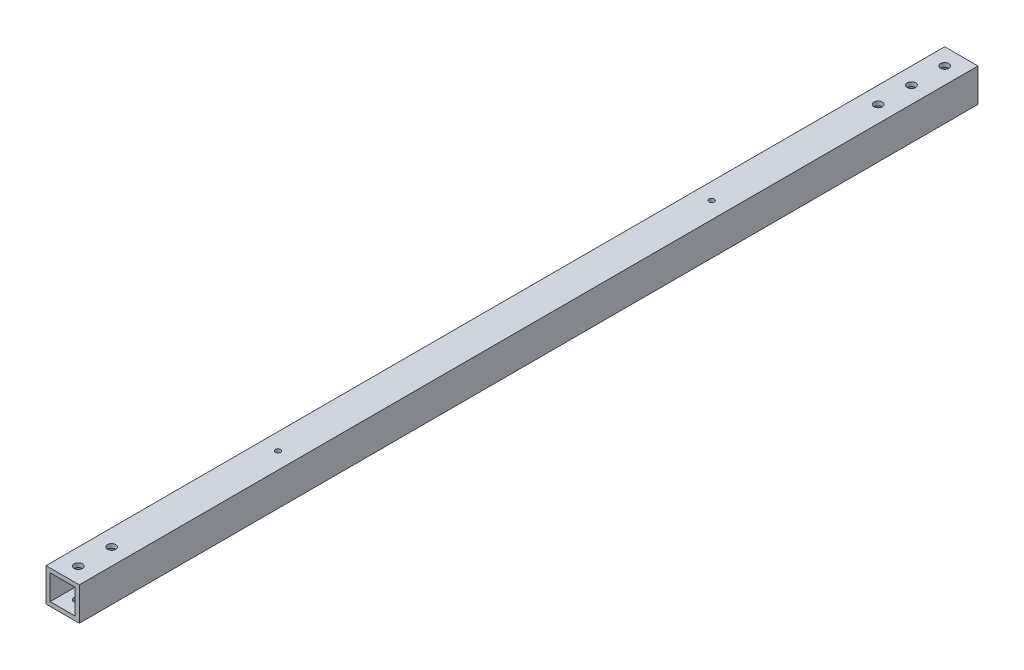
ISO-10303-21;
HEADER;
FILE_DESCRIPTION(('STEP AP214'),'2;1');
FILE_NAME('part.step','',(''),(''),'','','');
FILE_SCHEMA(('AUTOMOTIVE_DESIGN { 1 0 10303 214 1 1 1 1 }'));
ENDSEC;
DATA;
#1=APPLICATION_CONTEXT('core data for automotive mechanical design processes');
#2=APPLICATION_PROTOCOL_DEFINITION('international standard','automotive_design',2000,#1);
#3=PRODUCT_CONTEXT('',#1,'mechanical');
#4=PRODUCT('Part','Part','',(#3));
#5=PRODUCT_RELATED_PRODUCT_CATEGORY('part','',(#4));
#6=PRODUCT_DEFINITION_FORMATION('','',#4);
#7=PRODUCT_DEFINITION_CONTEXT('part definition',#1,'design');
#8=PRODUCT_DEFINITION('design','',#6,#7);
#9=PRODUCT_DEFINITION_SHAPE('','',#8);
#10=(LENGTH_UNIT() NAMED_UNIT(*) SI_UNIT(.MILLI.,.METRE.));
#11=(NAMED_UNIT(*) PLANE_ANGLE_UNIT() SI_UNIT($,.RADIAN.));
#12=(NAMED_UNIT(*) SI_UNIT($,.STERADIAN.) SOLID_ANGLE_UNIT());
#13=UNCERTAINTY_MEASURE_WITH_UNIT(LENGTH_MEASURE(1.E-05),#10,'distance_accuracy_value','');
#14=(GEOMETRIC_REPRESENTATION_CONTEXT(3) GLOBAL_UNCERTAINTY_ASSIGNED_CONTEXT((#13)) GLOBAL_UNIT_ASSIGNED_CONTEXT((#10,
#11,#12)) REPRESENTATION_CONTEXT('',''));
#15=CARTESIAN_POINT('',(0.,0.,0.));
#16=DIRECTION('',(0.,0.,1.));
#17=DIRECTION('',(1.,0.,0.));
#18=AXIS2_PLACEMENT_3D('',#15,#16,#17);
#19=CARTESIAN_POINT('',(0.,0.,342.9));
#20=DIRECTION('',(0.,0.,1.));
#21=DIRECTION('',(1.,0.,0.));
#22=AXIS2_PLACEMENT_3D('',#19,#20,#21);
#23=PLANE('',#22);
#24=DIRECTION('',(0.,-1.,0.));
#25=VECTOR('',#24,1.);
#26=CARTESIAN_POINT('',(-12.7,12.7,342.9));
#27=LINE('',#26,#25);
#28=CARTESIAN_POINT('',(-12.7,12.7,342.9));
#29=VERTEX_POINT('',#28);
#30=CARTESIAN_POINT('',(-12.7,-12.7,342.9));
#31=VERTEX_POINT('',#30);
#32=EDGE_CURVE('E115',#29,#31,#27,.T.);
#33=ORIENTED_EDGE('',*,*,#32,.T.);
#34=DIRECTION('',(1.,0.,0.));
#35=VECTOR('',#34,1.);
#36=CARTESIAN_POINT('',(-12.7,-12.7,342.9));
#37=LINE('',#36,#35);
#38=CARTESIAN_POINT('',(12.7,-12.7,342.9));
#39=VERTEX_POINT('',#38);
#40=EDGE_CURVE('E163',#31,#39,#37,.T.);
#41=ORIENTED_EDGE('',*,*,#40,.T.);
#42=DIRECTION('',(0.,1.,0.));
#43=VECTOR('',#42,1.);
#44=CARTESIAN_POINT('',(12.7,-12.7,342.9));
#45=LINE('',#44,#43);
#46=CARTESIAN_POINT('',(12.7,12.7,342.9));
#47=VERTEX_POINT('',#46);
#48=EDGE_CURVE('E165',#39,#47,#45,.T.);
#49=ORIENTED_EDGE('',*,*,#48,.T.);
#50=DIRECTION('',(-1.,0.,0.));
#51=VECTOR('',#50,1.);
#52=CARTESIAN_POINT('',(12.7,12.7,342.9));
#53=LINE('',#52,#51);
#54=EDGE_CURVE('E62',#47,#29,#53,.T.);
#55=ORIENTED_EDGE('',*,*,#54,.T.);
#56=EDGE_LOOP('',(#33,#41,#49,#55));
#57=FACE_BOUND('',#56,.T.);
#58=DIRECTION('',(1.,0.,0.));
#59=VECTOR('',#58,1.);
#60=CARTESIAN_POINT('',(-9.525,-9.525,342.9));
#61=LINE('',#60,#59);
#62=CARTESIAN_POINT('',(-9.525,-9.525,342.9));
#63=VERTEX_POINT('',#62);
#64=CARTESIAN_POINT('',(9.52500000000001,-9.525,342.9));
#65=VERTEX_POINT('',#64);
#66=EDGE_CURVE('E152',#63,#65,#61,.T.);
#67=ORIENTED_EDGE('',*,*,#66,.F.);
#68=DIRECTION('',(0.,-1.,0.));
#69=VECTOR('',#68,1.);
#70=CARTESIAN_POINT('',(-9.52500000000001,9.525,342.9));
#71=LINE('',#70,#69);
#72=CARTESIAN_POINT('',(-9.52500000000001,9.525,342.9));
#73=VERTEX_POINT('',#72);
#74=EDGE_CURVE('E112',#73,#63,#71,.T.);
#75=ORIENTED_EDGE('',*,*,#74,.F.);
#76=DIRECTION('',(-1.,0.,0.));
#77=VECTOR('',#76,1.);
#78=CARTESIAN_POINT('',(9.525,9.525,342.9));
#79=LINE('',#78,#77);
#80=CARTESIAN_POINT('',(9.525,9.525,342.9));
#81=VERTEX_POINT('',#80);
#82=EDGE_CURVE('E156',#81,#73,#79,.T.);
#83=ORIENTED_EDGE('',*,*,#82,.F.);
#84=DIRECTION('',(0.,1.,0.));
#85=VECTOR('',#84,1.);
#86=CARTESIAN_POINT('',(9.52500000000001,-9.525,342.9));
#87=LINE('',#86,#85);
#88=EDGE_CURVE('E154',#65,#81,#87,.T.);
#89=ORIENTED_EDGE('',*,*,#88,.F.);
#90=EDGE_LOOP('',(#67,#75,#83,#89));
#91=FACE_BOUND('',#90,.T.);
#92=ADVANCED_FACE('F37',(#57,#91),#23,.T.);
#93=CARTESIAN_POINT('',(-12.7,12.7,342.9));
#94=DIRECTION('',(1.,0.,0.));
#95=DIRECTION('',(0.,0.,-1.));
#96=AXIS2_PLACEMENT_3D('',#93,#94,#95);
#97=PLANE('',#96);
#98=DIRECTION('',(0.,0.,-1.));
#99=VECTOR('',#98,1.);
#100=CARTESIAN_POINT('',(-12.7,12.7,342.9));
#101=LINE('',#100,#99);
#102=CARTESIAN_POINT('',(-12.7,12.7,-342.9));
#103=VERTEX_POINT('',#102);
#104=EDGE_CURVE('E168',#29,#103,#101,.T.);
#105=ORIENTED_EDGE('',*,*,#104,.T.);
#106=DIRECTION('',(0.,-1.,0.));
#107=VECTOR('',#106,1.);
#108=CARTESIAN_POINT('',(-12.7,12.7,-342.9));
#109=LINE('',#108,#107);
#110=CARTESIAN_POINT('',(-12.7,-12.7,-342.9));
#111=VERTEX_POINT('',#110);
#112=EDGE_CURVE('E139',#103,#111,#109,.T.);
#113=ORIENTED_EDGE('',*,*,#112,.T.);
#114=DIRECTION('',(0.,0.,-1.));
#115=VECTOR('',#114,1.);
#116=CARTESIAN_POINT('',(-12.7,-12.7,342.9));
#117=LINE('',#116,#115);
#118=EDGE_CURVE('E11',#31,#111,#117,.T.);
#119=ORIENTED_EDGE('',*,*,#118,.F.);
#120=ORIENTED_EDGE('',*,*,#32,.F.);
#121=EDGE_LOOP('',(#105,#113,#119,#120));
#122=FACE_BOUND('',#121,.T.);
#123=ADVANCED_FACE('F39',(#122),#97,.F.);
#124=CARTESIAN_POINT('',(-12.7,-12.7,342.9));
#125=DIRECTION('',(0.,1.,0.));
#126=DIRECTION('',(-1.,0.,0.));
#127=AXIS2_PLACEMENT_3D('',#124,#125,#126);
#128=PLANE('',#127);
#129=CARTESIAN_POINT('',(7.23379689482329E-13,-12.7,330.911799987541));
#130=DIRECTION('',(0.,1.,0.));
#131=DIRECTION('',(0.,0.,1.));
#132=AXIS2_PLACEMENT_3D('',#129,#130,#131);
#133=CIRCLE('',#132,3.96239999999999);
#134=CARTESIAN_POINT('',(7.23379689482329E-13,-12.7,334.874199987541));
#135=VERTEX_POINT('',#134);
#136=EDGE_CURVE('E285',#135,#135,#133,.T.);
#137=ORIENTED_EDGE('',*,*,#136,.T.);
#138=EDGE_LOOP('',(#137));
#139=FACE_BOUND('',#138,.T.);
#140=CARTESIAN_POINT('',(0.,-12.7,305.511799987541));
#141=DIRECTION('',(0.,1.,0.));
#142=DIRECTION('',(0.,0.,1.));
#143=AXIS2_PLACEMENT_3D('',#140,#141,#142);
#144=CIRCLE('',#143,3.96239999999999);
#145=CARTESIAN_POINT('',(0.,-12.7,309.474199987541));
#146=VERTEX_POINT('',#145);
#147=EDGE_CURVE('E289',#146,#146,#144,.T.);
#148=ORIENTED_EDGE('',*,*,#147,.T.);
#149=EDGE_LOOP('',(#148));
#150=FACE_BOUND('',#149,.T.);
#151=CARTESIAN_POINT('',(-3.7175124090183E-12,-12.7,-330.199999999998));
#152=DIRECTION('',(0.,1.,0.));
#153=DIRECTION('',(0.,0.,1.));
#154=AXIS2_PLACEMENT_3D('',#151,#152,#153);
#155=CIRCLE('',#154,3.96239999999999);
#156=CARTESIAN_POINT('',(-3.7175124090183E-12,-12.7,-326.237599999998));
#157=VERTEX_POINT('',#156);
#158=EDGE_CURVE('E197',#157,#157,#155,.T.);
#159=ORIENTED_EDGE('',*,*,#158,.T.);
#160=EDGE_LOOP('',(#159));
#161=FACE_BOUND('',#160,.T.);
#162=CARTESIAN_POINT('',(0.,-12.7,-304.799999999998));
#163=DIRECTION('',(0.,1.,0.));
#164=DIRECTION('',(0.,0.,1.));
#165=AXIS2_PLACEMENT_3D('',#162,#163,#164);
#166=CIRCLE('',#165,3.96239999999999);
#167=CARTESIAN_POINT('',(0.,-12.7,-300.837599999998));
#168=VERTEX_POINT('',#167);
#169=EDGE_CURVE('E189',#168,#168,#166,.T.);
#170=ORIENTED_EDGE('',*,*,#169,.T.);
#171=EDGE_LOOP('',(#170));
#172=FACE_BOUND('',#171,.T.);
#173=CARTESIAN_POINT('',(-2.38524477946811E-12,-12.7,-279.399999999999));
#174=DIRECTION('',(0.,1.,0.));
#175=DIRECTION('',(0.,0.,1.));
#176=AXIS2_PLACEMENT_3D('',#173,#174,#175);
#177=CIRCLE('',#176,3.96239999999999);
#178=CARTESIAN_POINT('',(-2.38524477946811E-12,-12.7,-275.437599999999));
#179=VERTEX_POINT('',#178);
#180=EDGE_CURVE('E210',#179,#179,#177,.T.);
#181=ORIENTED_EDGE('',*,*,#180,.T.);
#182=EDGE_LOOP('',(#181));
#183=FACE_BOUND('',#182,.T.);
#184=CARTESIAN_POINT('',(0.,-12.7,-152.4));
#185=DIRECTION('',(0.,1.,0.));
#186=DIRECTION('',(0.,0.,1.));
#187=AXIS2_PLACEMENT_3D('',#184,#185,#186);
#188=CIRCLE('',#187,1.98437499999998);
#189=CARTESIAN_POINT('',(0.,-12.7,-150.415625));
#190=VERTEX_POINT('',#189);
#191=EDGE_CURVE('E223',#190,#190,#188,.T.);
#192=ORIENTED_EDGE('',*,*,#191,.T.);
#193=EDGE_LOOP('',(#192));
#194=FACE_BOUND('',#193,.T.);
#195=CARTESIAN_POINT('',(0.,-12.7,178.5118096));
#196=DIRECTION('',(0.,1.,0.));
#197=DIRECTION('',(0.,0.,1.));
#198=AXIS2_PLACEMENT_3D('',#195,#196,#197);
#199=CIRCLE('',#198,1.98437499999998);
#200=CARTESIAN_POINT('',(0.,-12.7,180.4961846));
#201=VERTEX_POINT('',#200);
#202=EDGE_CURVE('E235',#201,#201,#199,.T.);
#203=ORIENTED_EDGE('',*,*,#202,.T.);
#204=EDGE_LOOP('',(#203));
#205=FACE_BOUND('',#204,.T.);
#206=ORIENTED_EDGE('',*,*,#118,.T.);
#207=DIRECTION('',(1.,0.,0.));
#208=VECTOR('',#207,1.);
#209=CARTESIAN_POINT('',(-12.7,-12.7,-342.9));
#210=LINE('',#209,#208);
#211=CARTESIAN_POINT('',(12.7,-12.7,-342.9));
#212=VERTEX_POINT('',#211);
#213=EDGE_CURVE('E142',#111,#212,#210,.T.);
#214=ORIENTED_EDGE('',*,*,#213,.T.);
#215=DIRECTION('',(0.,0.,-1.));
#216=VECTOR('',#215,1.);
#217=CARTESIAN_POINT('',(12.7,-12.7,342.9));
#218=LINE('',#217,#216);
#219=EDGE_CURVE('E46',#39,#212,#218,.T.);
#220=ORIENTED_EDGE('',*,*,#219,.F.);
#221=ORIENTED_EDGE('',*,*,#40,.F.);
#222=EDGE_LOOP('',(#206,#214,#220,#221));
#223=FACE_BOUND('',#222,.T.);
#224=ADVANCED_FACE('F266',(#139,#150,#161,#172,#183,#194,#205,#223),#128,.F.);
#225=CARTESIAN_POINT('',(12.7,-12.7,342.9));
#226=DIRECTION('',(-1.,0.,0.));
#227=DIRECTION('',(0.,0.,1.));
#228=AXIS2_PLACEMENT_3D('',#225,#226,#227);
#229=PLANE('',#228);
#230=ORIENTED_EDGE('',*,*,#219,.T.);
#231=DIRECTION('',(0.,1.,0.));
#232=VECTOR('',#231,1.);
#233=CARTESIAN_POINT('',(12.7,-12.7,-342.9));
#234=LINE('',#233,#232);
#235=CARTESIAN_POINT('',(12.7,12.7,-342.9));
#236=VERTEX_POINT('',#235);
#237=EDGE_CURVE('E145',#212,#236,#234,.T.);
#238=ORIENTED_EDGE('',*,*,#237,.T.);
#239=DIRECTION('',(0.,0.,-1.));
#240=VECTOR('',#239,1.);
#241=CARTESIAN_POINT('',(12.7,12.7,342.9));
#242=LINE('',#241,#240);
#243=EDGE_CURVE('E170',#47,#236,#242,.T.);
#244=ORIENTED_EDGE('',*,*,#243,.F.);
#245=ORIENTED_EDGE('',*,*,#48,.F.);
#246=EDGE_LOOP('',(#230,#238,#244,#245));
#247=FACE_BOUND('',#246,.T.);
#248=ADVANCED_FACE('F273',(#247),#229,.F.);
#249=CARTESIAN_POINT('',(12.7,12.7,342.9));
#250=DIRECTION('',(0.,-1.,0.));
#251=DIRECTION('',(1.,0.,0.));
#252=AXIS2_PLACEMENT_3D('',#249,#250,#251);
#253=PLANE('',#252);
#254=CARTESIAN_POINT('',(7.23379689482329E-13,12.7,330.911799987541));
#255=DIRECTION('',(0.,1.,0.));
#256=DIRECTION('',(0.,0.,1.));
#257=AXIS2_PLACEMENT_3D('',#254,#255,#256);
#258=CIRCLE('',#257,3.17499999999999);
#259=CARTESIAN_POINT('',(7.23379689482329E-13,12.7,334.086799987541));
#260=VERTEX_POINT('',#259);
#261=EDGE_CURVE('E376',#260,#260,#258,.T.);
#262=ORIENTED_EDGE('',*,*,#261,.F.);
#263=EDGE_LOOP('',(#262));
#264=FACE_BOUND('',#263,.T.);
#265=CARTESIAN_POINT('',(0.,12.7,305.511799987541));
#266=DIRECTION('',(0.,1.,0.));
#267=DIRECTION('',(0.,0.,1.));
#268=AXIS2_PLACEMENT_3D('',#265,#266,#267);
#269=CIRCLE('',#268,3.17499999999999);
#270=CARTESIAN_POINT('',(0.,12.7,308.686799987541));
#271=VERTEX_POINT('',#270);
#272=EDGE_CURVE('E387',#271,#271,#269,.T.);
#273=ORIENTED_EDGE('',*,*,#272,.F.);
#274=EDGE_LOOP('',(#273));
#275=FACE_BOUND('',#274,.T.);
#276=CARTESIAN_POINT('',(-3.7175124090183E-12,12.7,-330.199999999998));
#277=DIRECTION('',(0.,1.,0.));
#278=DIRECTION('',(0.,0.,1.));
#279=AXIS2_PLACEMENT_3D('',#276,#277,#278);
#280=CIRCLE('',#279,3.17499999999999);
#281=CARTESIAN_POINT('',(-3.7175124090183E-12,12.7,-327.024999999998));
#282=VERTEX_POINT('',#281);
#283=EDGE_CURVE('E192',#282,#282,#280,.T.);
#284=ORIENTED_EDGE('',*,*,#283,.F.);
#285=EDGE_LOOP('',(#284));
#286=FACE_BOUND('',#285,.T.);
#287=CARTESIAN_POINT('',(0.,12.7,-304.799999999998));
#288=DIRECTION('',(0.,1.,0.));
#289=DIRECTION('',(0.,0.,1.));
#290=AXIS2_PLACEMENT_3D('',#287,#288,#289);
#291=CIRCLE('',#290,3.17499999999999);
#292=CARTESIAN_POINT('',(0.,12.7,-301.624999999998));
#293=VERTEX_POINT('',#292);
#294=EDGE_CURVE('E203',#293,#293,#291,.T.);
#295=ORIENTED_EDGE('',*,*,#294,.F.);
#296=EDGE_LOOP('',(#295));
#297=FACE_BOUND('',#296,.T.);
#298=CARTESIAN_POINT('',(-2.38524477946811E-12,12.7,-279.399999999999));
#299=DIRECTION('',(0.,1.,0.));
#300=DIRECTION('',(0.,0.,1.));
#301=AXIS2_PLACEMENT_3D('',#298,#299,#300);
#302=CIRCLE('',#301,3.17499999999999);
#303=CARTESIAN_POINT('',(-2.38524477946811E-12,12.7,-276.224999999999));
#304=VERTEX_POINT('',#303);
#305=EDGE_CURVE('E213',#304,#304,#302,.T.);
#306=ORIENTED_EDGE('',*,*,#305,.F.);
#307=EDGE_LOOP('',(#306));
#308=FACE_BOUND('',#307,.T.);
#309=CARTESIAN_POINT('',(0.,12.7,-152.4));
#310=DIRECTION('',(0.,1.,0.));
#311=DIRECTION('',(0.,0.,1.));
#312=AXIS2_PLACEMENT_3D('',#309,#310,#311);
#313=CIRCLE('',#312,1.98437499999999);
#314=CARTESIAN_POINT('',(0.,12.7,-150.415625));
#315=VERTEX_POINT('',#314);
#316=EDGE_CURVE('E220',#315,#315,#313,.T.);
#317=ORIENTED_EDGE('',*,*,#316,.F.);
#318=EDGE_LOOP('',(#317));
#319=FACE_BOUND('',#318,.T.);
#320=CARTESIAN_POINT('',(0.,12.7,178.5118096));
#321=DIRECTION('',(0.,1.,0.));
#322=DIRECTION('',(0.,0.,1.));
#323=AXIS2_PLACEMENT_3D('',#320,#321,#322);
#324=CIRCLE('',#323,1.98437499999999);
#325=CARTESIAN_POINT('',(0.,12.7,180.4961846));
#326=VERTEX_POINT('',#325);
#327=EDGE_CURVE('E232',#326,#326,#324,.T.);
#328=ORIENTED_EDGE('',*,*,#327,.F.);
#329=EDGE_LOOP('',(#328));
#330=FACE_BOUND('',#329,.T.);
#331=ORIENTED_EDGE('',*,*,#243,.T.);
#332=DIRECTION('',(-1.,0.,0.));
#333=VECTOR('',#332,1.);
#334=CARTESIAN_POINT('',(12.7,12.7,-342.9));
#335=LINE('',#334,#333);
#336=EDGE_CURVE('E148',#236,#103,#335,.T.);
#337=ORIENTED_EDGE('',*,*,#336,.T.);
#338=ORIENTED_EDGE('',*,*,#104,.F.);
#339=ORIENTED_EDGE('',*,*,#54,.F.);
#340=EDGE_LOOP('',(#331,#337,#338,#339));
#341=FACE_BOUND('',#340,.T.);
#342=ADVANCED_FACE('F270',(#264,#275,#286,#297,#308,#319,#330,#341),#253,.F.);
#343=CARTESIAN_POINT('',(-9.52500000000001,9.525,342.9));
#344=DIRECTION('',(1.,0.,0.));
#345=DIRECTION('',(0.,1.,0.));
#346=AXIS2_PLACEMENT_3D('',#343,#344,#345);
#347=PLANE('',#346);
#348=DIRECTION('',(0.,0.,-1.));
#349=VECTOR('',#348,1.);
#350=CARTESIAN_POINT('',(-9.525,-9.525,342.9));
#351=LINE('',#350,#349);
#352=CARTESIAN_POINT('',(-9.525,-9.525,-342.9));
#353=VERTEX_POINT('',#352);
#354=EDGE_CURVE('E104',#63,#353,#351,.T.);
#355=ORIENTED_EDGE('',*,*,#354,.T.);
#356=DIRECTION('',(0.,-1.,0.));
#357=VECTOR('',#356,1.);
#358=CARTESIAN_POINT('',(-9.52500000000001,9.525,-342.9));
#359=LINE('',#358,#357);
#360=CARTESIAN_POINT('',(-9.52500000000001,9.525,-342.9));
#361=VERTEX_POINT('',#360);
#362=EDGE_CURVE('E109',#361,#353,#359,.T.);
#363=ORIENTED_EDGE('',*,*,#362,.F.);
#364=DIRECTION('',(0.,0.,-1.));
#365=VECTOR('',#364,1.);
#366=CARTESIAN_POINT('',(-9.52500000000001,9.525,342.9));
#367=LINE('',#366,#365);
#368=EDGE_CURVE('E158',#73,#361,#367,.T.);
#369=ORIENTED_EDGE('',*,*,#368,.F.);
#370=ORIENTED_EDGE('',*,*,#74,.T.);
#371=EDGE_LOOP('',(#355,#363,#369,#370));
#372=FACE_BOUND('',#371,.T.);
#373=ADVANCED_FACE('F106',(#372),#347,.T.);
#374=CARTESIAN_POINT('',(-9.525,-9.525,342.9));
#375=DIRECTION('',(0.,1.,0.));
#376=DIRECTION('',(0.,0.,1.));
#377=AXIS2_PLACEMENT_3D('',#374,#375,#376);
#378=PLANE('',#377);
#379=CARTESIAN_POINT('',(7.23379689482329E-13,-9.525,330.911799987541));
#380=DIRECTION('',(0.,1.,0.));
#381=DIRECTION('',(0.,0.,1.));
#382=AXIS2_PLACEMENT_3D('',#379,#380,#381);
#383=CIRCLE('',#382,3.17499999999999);
#384=CARTESIAN_POINT('',(7.23379689482329E-13,-9.525,334.086799987541));
#385=VERTEX_POINT('',#384);
#386=EDGE_CURVE('E383',#385,#385,#383,.T.);
#387=ORIENTED_EDGE('',*,*,#386,.F.);
#388=EDGE_LOOP('',(#387));
#389=FACE_BOUND('',#388,.T.);
#390=CARTESIAN_POINT('',(0.,-9.525,305.511799987541));
#391=DIRECTION('',(0.,1.,0.));
#392=DIRECTION('',(0.,0.,1.));
#393=AXIS2_PLACEMENT_3D('',#390,#391,#392);
#394=CIRCLE('',#393,3.17499999999999);
#395=CARTESIAN_POINT('',(0.,-9.525,308.686799987541));
#396=VERTEX_POINT('',#395);
#397=EDGE_CURVE('E393',#396,#396,#394,.T.);
#398=ORIENTED_EDGE('',*,*,#397,.F.);
#399=EDGE_LOOP('',(#398));
#400=FACE_BOUND('',#399,.T.);
#401=CARTESIAN_POINT('',(-3.7175124090183E-12,-9.525,-330.199999999998));
#402=DIRECTION('',(0.,1.,0.));
#403=DIRECTION('',(0.,0.,1.));
#404=AXIS2_PLACEMENT_3D('',#401,#402,#403);
#405=CIRCLE('',#404,3.17499999999999);
#406=CARTESIAN_POINT('',(-3.7175124090183E-12,-9.525,-327.024999999998));
#407=VERTEX_POINT('',#406);
#408=EDGE_CURVE('E182',#407,#407,#405,.T.);
#409=ORIENTED_EDGE('',*,*,#408,.F.);
#410=EDGE_LOOP('',(#409));
#411=FACE_BOUND('',#410,.T.);
#412=CARTESIAN_POINT('',(0.,-9.525,-304.799999999998));
#413=DIRECTION('',(0.,1.,0.));
#414=DIRECTION('',(0.,0.,1.));
#415=AXIS2_PLACEMENT_3D('',#412,#413,#414);
#416=CIRCLE('',#415,3.17499999999999);
#417=CARTESIAN_POINT('',(0.,-9.525,-301.624999999998));
#418=VERTEX_POINT('',#417);
#419=EDGE_CURVE('E180',#418,#418,#416,.T.);
#420=ORIENTED_EDGE('',*,*,#419,.F.);
#421=EDGE_LOOP('',(#420));
#422=FACE_BOUND('',#421,.T.);
#423=CARTESIAN_POINT('',(-2.38524477946811E-12,-9.525,-279.399999999999));
#424=DIRECTION('',(0.,1.,0.));
#425=DIRECTION('',(0.,0.,1.));
#426=AXIS2_PLACEMENT_3D('',#423,#424,#425);
#427=CIRCLE('',#426,3.17499999999999);
#428=CARTESIAN_POINT('',(-2.38524477946811E-12,-9.525,-276.224999999999));
#429=VERTEX_POINT('',#428);
#430=EDGE_CURVE('E176',#429,#429,#427,.T.);
#431=ORIENTED_EDGE('',*,*,#430,.F.);
#432=EDGE_LOOP('',(#431));
#433=FACE_BOUND('',#432,.T.);
#434=CARTESIAN_POINT('',(0.,-9.525,-152.4));
#435=DIRECTION('',(0.,1.,0.));
#436=DIRECTION('',(0.,0.,1.));
#437=AXIS2_PLACEMENT_3D('',#434,#435,#436);
#438=CIRCLE('',#437,1.98437499999999);
#439=CARTESIAN_POINT('',(0.,-9.525,-150.415625));
#440=VERTEX_POINT('',#439);
#441=EDGE_CURVE('E229',#440,#440,#438,.T.);
#442=ORIENTED_EDGE('',*,*,#441,.F.);
#443=EDGE_LOOP('',(#442));
#444=FACE_BOUND('',#443,.T.);
#445=CARTESIAN_POINT('',(0.,-9.525,178.5118096));
#446=DIRECTION('',(0.,1.,0.));
#447=DIRECTION('',(0.,0.,1.));
#448=AXIS2_PLACEMENT_3D('',#445,#446,#447);
#449=CIRCLE('',#448,1.98437499999999);
#450=CARTESIAN_POINT('',(0.,-9.525,180.4961846));
#451=VERTEX_POINT('',#450);
#452=EDGE_CURVE('E130',#451,#451,#449,.T.);
#453=ORIENTED_EDGE('',*,*,#452,.F.);
#454=EDGE_LOOP('',(#453));
#455=FACE_BOUND('',#454,.T.);
#456=DIRECTION('',(0.,0.,-1.));
#457=VECTOR('',#456,1.);
#458=CARTESIAN_POINT('',(9.52500000000001,-9.525,342.9));
#459=LINE('',#458,#457);
#460=CARTESIAN_POINT('',(9.52500000000001,-9.525,-342.9));
#461=VERTEX_POINT('',#460);
#462=EDGE_CURVE('E116',#65,#461,#459,.T.);
#463=ORIENTED_EDGE('',*,*,#462,.T.);
#464=DIRECTION('',(1.,0.,0.));
#465=VECTOR('',#464,1.);
#466=CARTESIAN_POINT('',(-9.525,-9.525,-342.9));
#467=LINE('',#466,#465);
#468=EDGE_CURVE('E119',#353,#461,#467,.T.);
#469=ORIENTED_EDGE('',*,*,#468,.F.);
#470=ORIENTED_EDGE('',*,*,#354,.F.);
#471=ORIENTED_EDGE('',*,*,#66,.T.);
#472=EDGE_LOOP('',(#463,#469,#470,#471));
#473=FACE_BOUND('',#472,.T.);
#474=ADVANCED_FACE('F120',(#389,#400,#411,#422,#433,#444,#455,#473),#378,.T.);
#475=CARTESIAN_POINT('',(9.52500000000001,-9.525,342.9));
#476=DIRECTION('',(-1.,0.,0.));
#477=DIRECTION('',(0.,-1.,0.));
#478=AXIS2_PLACEMENT_3D('',#475,#476,#477);
#479=PLANE('',#478);
#480=DIRECTION('',(0.,0.,-1.));
#481=VECTOR('',#480,1.);
#482=CARTESIAN_POINT('',(9.525,9.525,342.9));
#483=LINE('',#482,#481);
#484=CARTESIAN_POINT('',(9.525,9.525,-342.9));
#485=VERTEX_POINT('',#484);
#486=EDGE_CURVE('E54',#81,#485,#483,.T.);
#487=ORIENTED_EDGE('',*,*,#486,.T.);
#488=DIRECTION('',(0.,1.,0.));
#489=VECTOR('',#488,1.);
#490=CARTESIAN_POINT('',(9.52500000000001,-9.525,-342.9));
#491=LINE('',#490,#489);
#492=EDGE_CURVE('E125',#461,#485,#491,.T.);
#493=ORIENTED_EDGE('',*,*,#492,.F.);
#494=ORIENTED_EDGE('',*,*,#462,.F.);
#495=ORIENTED_EDGE('',*,*,#88,.T.);
#496=EDGE_LOOP('',(#487,#493,#494,#495));
#497=FACE_BOUND('',#496,.T.);
#498=ADVANCED_FACE('F245',(#497),#479,.T.);
#499=CARTESIAN_POINT('',(9.525,9.525,342.9));
#500=DIRECTION('',(0.,-1.,0.));
#501=DIRECTION('',(0.,0.,-1.));
#502=AXIS2_PLACEMENT_3D('',#499,#500,#501);
#503=PLANE('',#502);
#504=CARTESIAN_POINT('',(7.23379689482329E-13,9.525,330.911799987541));
#505=DIRECTION('',(0.,-1.,0.));
#506=DIRECTION('',(0.,0.,-1.));
#507=AXIS2_PLACEMENT_3D('',#504,#505,#506);
#508=CIRCLE('',#507,3.17499999999999);
#509=CARTESIAN_POINT('',(7.23379689482329E-13,9.525,327.736799987541));
#510=VERTEX_POINT('',#509);
#511=EDGE_CURVE('E41',#510,#510,#508,.T.);
#512=ORIENTED_EDGE('',*,*,#511,.F.);
#513=EDGE_LOOP('',(#512));
#514=FACE_BOUND('',#513,.T.);
#515=CARTESIAN_POINT('',(0.,9.525,305.511799987541));
#516=DIRECTION('',(0.,-1.,0.));
#517=DIRECTION('',(0.,0.,-1.));
#518=AXIS2_PLACEMENT_3D('',#515,#516,#517);
#519=CIRCLE('',#518,3.17499999999999);
#520=CARTESIAN_POINT('',(0.,9.525,302.336799987541));
#521=VERTEX_POINT('',#520);
#522=EDGE_CURVE('E396',#521,#521,#519,.T.);
#523=ORIENTED_EDGE('',*,*,#522,.F.);
#524=EDGE_LOOP('',(#523));
#525=FACE_BOUND('',#524,.T.);
#526=CARTESIAN_POINT('',(-3.7175124090183E-12,9.525,-330.199999999998));
#527=DIRECTION('',(0.,-1.,0.));
#528=DIRECTION('',(0.,0.,-1.));
#529=AXIS2_PLACEMENT_3D('',#526,#527,#528);
#530=CIRCLE('',#529,3.17499999999999);
#531=CARTESIAN_POINT('',(-3.7175124090183E-12,9.525,-333.374999999998));
#532=VERTEX_POINT('',#531);
#533=EDGE_CURVE('E184',#532,#532,#530,.T.);
#534=ORIENTED_EDGE('',*,*,#533,.F.);
#535=EDGE_LOOP('',(#534));
#536=FACE_BOUND('',#535,.T.);
#537=CARTESIAN_POINT('',(0.,9.525,-304.799999999998));
#538=DIRECTION('',(0.,-1.,0.));
#539=DIRECTION('',(0.,0.,-1.));
#540=AXIS2_PLACEMENT_3D('',#537,#538,#539);
#541=CIRCLE('',#540,3.17499999999999);
#542=CARTESIAN_POINT('',(0.,9.525,-307.974999999998));
#543=VERTEX_POINT('',#542);
#544=EDGE_CURVE('E178',#543,#543,#541,.T.);
#545=ORIENTED_EDGE('',*,*,#544,.F.);
#546=EDGE_LOOP('',(#545));
#547=FACE_BOUND('',#546,.T.);
#548=CARTESIAN_POINT('',(-2.38524477946811E-12,9.525,-279.399999999999));
#549=DIRECTION('',(0.,-1.,0.));
#550=DIRECTION('',(0.,0.,-1.));
#551=AXIS2_PLACEMENT_3D('',#548,#549,#550);
#552=CIRCLE('',#551,3.17499999999999);
#553=CARTESIAN_POINT('',(-2.38524477946811E-12,9.525,-282.574999999999));
#554=VERTEX_POINT('',#553);
#555=EDGE_CURVE('E173',#554,#554,#552,.T.);
#556=ORIENTED_EDGE('',*,*,#555,.F.);
#557=EDGE_LOOP('',(#556));
#558=FACE_BOUND('',#557,.T.);
#559=CARTESIAN_POINT('',(0.,9.525,-152.4));
#560=DIRECTION('',(0.,-1.,0.));
#561=DIRECTION('',(0.,0.,-1.));
#562=AXIS2_PLACEMENT_3D('',#559,#560,#561);
#563=CIRCLE('',#562,1.98437499999999);
#564=CARTESIAN_POINT('',(0.,9.525,-154.384375));
#565=VERTEX_POINT('',#564);
#566=EDGE_CURVE('E226',#565,#565,#563,.T.);
#567=ORIENTED_EDGE('',*,*,#566,.F.);
#568=EDGE_LOOP('',(#567));
#569=FACE_BOUND('',#568,.T.);
#570=CARTESIAN_POINT('',(0.,9.525,178.5118096));
#571=DIRECTION('',(0.,-1.,0.));
#572=DIRECTION('',(0.,0.,-1.));
#573=AXIS2_PLACEMENT_3D('',#570,#571,#572);
#574=CIRCLE('',#573,1.98437499999999);
#575=CARTESIAN_POINT('',(0.,9.525,176.5274346));
#576=VERTEX_POINT('',#575);
#577=EDGE_CURVE('E133',#576,#576,#574,.T.);
#578=ORIENTED_EDGE('',*,*,#577,.F.);
#579=EDGE_LOOP('',(#578));
#580=FACE_BOUND('',#579,.T.);
#581=ORIENTED_EDGE('',*,*,#368,.T.);
#582=DIRECTION('',(-1.,0.,0.));
#583=VECTOR('',#582,1.);
#584=CARTESIAN_POINT('',(9.525,9.525,-342.9));
#585=LINE('',#584,#583);
#586=EDGE_CURVE('E129',#485,#361,#585,.T.);
#587=ORIENTED_EDGE('',*,*,#586,.F.);
#588=ORIENTED_EDGE('',*,*,#486,.F.);
#589=ORIENTED_EDGE('',*,*,#82,.T.);
#590=EDGE_LOOP('',(#581,#587,#588,#589));
#591=FACE_BOUND('',#590,.T.);
#592=ADVANCED_FACE('F243',(#514,#525,#536,#547,#558,#569,#580,#591),#503,.T.);
#593=CARTESIAN_POINT('',(0.,0.,-342.9));
#594=DIRECTION('',(0.,0.,1.));
#595=DIRECTION('',(1.,0.,0.));
#596=AXIS2_PLACEMENT_3D('',#593,#594,#595);
#597=PLANE('',#596);
#598=ORIENTED_EDGE('',*,*,#586,.T.);
#599=ORIENTED_EDGE('',*,*,#362,.T.);
#600=ORIENTED_EDGE('',*,*,#468,.T.);
#601=ORIENTED_EDGE('',*,*,#492,.T.);
#602=EDGE_LOOP('',(#598,#599,#600,#601));
#603=FACE_BOUND('',#602,.T.);
#604=ORIENTED_EDGE('',*,*,#112,.F.);
#605=ORIENTED_EDGE('',*,*,#336,.F.);
#606=ORIENTED_EDGE('',*,*,#237,.F.);
#607=ORIENTED_EDGE('',*,*,#213,.F.);
#608=EDGE_LOOP('',(#604,#605,#606,#607));
#609=FACE_BOUND('',#608,.T.);
#610=ADVANCED_FACE('F127',(#603,#609),#597,.F.);
#611=CARTESIAN_POINT('',(0.,12.7,178.5118096));
#612=DIRECTION('',(0.,1.,0.));
#613=DIRECTION('',(0.,0.,1.));
#614=AXIS2_PLACEMENT_3D('',#611,#612,#613);
#615=CYLINDRICAL_SURFACE('',#614,1.98437499999999);
#616=ORIENTED_EDGE('',*,*,#577,.T.);
#617=EDGE_LOOP('',(#616));
#618=FACE_BOUND('',#617,.T.);
#619=ORIENTED_EDGE('',*,*,#327,.T.);
#620=EDGE_LOOP('',(#619));
#621=FACE_BOUND('',#620,.T.);
#622=ADVANCED_FACE('F240',(#618,#621),#615,.F.);
#623=ORIENTED_EDGE('',*,*,#452,.T.);
#624=EDGE_LOOP('',(#623));
#625=FACE_BOUND('',#624,.T.);
#626=ORIENTED_EDGE('',*,*,#202,.F.);
#627=EDGE_LOOP('',(#626));
#628=FACE_BOUND('',#627,.T.);
#629=ADVANCED_FACE('F316',(#625,#628),#615,.F.);
#630=CARTESIAN_POINT('',(0.,12.7,-152.4));
#631=DIRECTION('',(0.,1.,0.));
#632=DIRECTION('',(0.,0.,1.));
#633=AXIS2_PLACEMENT_3D('',#630,#631,#632);
#634=CYLINDRICAL_SURFACE('',#633,1.98437499999999);
#635=ORIENTED_EDGE('',*,*,#566,.T.);
#636=EDGE_LOOP('',(#635));
#637=FACE_BOUND('',#636,.T.);
#638=ORIENTED_EDGE('',*,*,#316,.T.);
#639=EDGE_LOOP('',(#638));
#640=FACE_BOUND('',#639,.T.);
#641=ADVANCED_FACE('F319',(#637,#640),#634,.F.);
#642=ORIENTED_EDGE('',*,*,#441,.T.);
#643=EDGE_LOOP('',(#642));
#644=FACE_BOUND('',#643,.T.);
#645=ORIENTED_EDGE('',*,*,#191,.F.);
#646=EDGE_LOOP('',(#645));
#647=FACE_BOUND('',#646,.T.);
#648=ADVANCED_FACE('F322',(#644,#647),#634,.F.);
#649=CARTESIAN_POINT('',(-2.38524477946811E-12,12.7,-279.399999999999));
#650=DIRECTION('',(0.,1.,0.));
#651=DIRECTION('',(0.,0.,1.));
#652=AXIS2_PLACEMENT_3D('',#649,#650,#651);
#653=CYLINDRICAL_SURFACE('',#652,3.17499999999999);
#654=ORIENTED_EDGE('',*,*,#555,.T.);
#655=EDGE_LOOP('',(#654));
#656=FACE_BOUND('',#655,.T.);
#657=ORIENTED_EDGE('',*,*,#305,.T.);
#658=EDGE_LOOP('',(#657));
#659=FACE_BOUND('',#658,.T.);
#660=ADVANCED_FACE('F330',(#656,#659),#653,.F.);
#661=ORIENTED_EDGE('',*,*,#430,.T.);
#662=EDGE_LOOP('',(#661));
#663=FACE_BOUND('',#662,.T.);
#664=CARTESIAN_POINT('',(-2.38524477946811E-12,-11.7941999161542,-279.399999999999));
#665=DIRECTION('',(0.,1.,0.));
#666=DIRECTION('',(0.,0.,1.));
#667=AXIS2_PLACEMENT_3D('',#664,#665,#666);
#668=CIRCLE('',#667,3.17499999999999);
#669=CARTESIAN_POINT('',(-2.38524477946811E-12,-11.7941999161542,-276.224999999999));
#670=VERTEX_POINT('',#669);
#671=EDGE_CURVE('E177',#670,#670,#668,.T.);
#672=ORIENTED_EDGE('',*,*,#671,.F.);
#673=EDGE_LOOP('',(#672));
#674=FACE_BOUND('',#673,.T.);
#675=ADVANCED_FACE('F328',(#663,#674),#653,.F.);
#676=CARTESIAN_POINT('',(-2.38524477946811E-12,-11.7941999161542,-279.399999999999));
#677=DIRECTION('',(0.,-1.,0.));
#678=DIRECTION('',(0.,0.,-1.));
#679=AXIS2_PLACEMENT_3D('',#676,#677,#678);
#680=CONICAL_SURFACE('',#679,3.17499999999999,0.715584993317674);
#681=ORIENTED_EDGE('',*,*,#180,.F.);
#682=EDGE_LOOP('',(#681));
#683=FACE_BOUND('',#682,.T.);
#684=ORIENTED_EDGE('',*,*,#671,.T.);
#685=EDGE_LOOP('',(#684));
#686=FACE_BOUND('',#685,.T.);
#687=ADVANCED_FACE('F324',(#683,#686),#680,.F.);
#688=CARTESIAN_POINT('',(0.,12.7,-304.799999999998));
#689=DIRECTION('',(0.,1.,0.));
#690=DIRECTION('',(0.,0.,1.));
#691=AXIS2_PLACEMENT_3D('',#688,#689,#690);
#692=CYLINDRICAL_SURFACE('',#691,3.17499999999999);
#693=ORIENTED_EDGE('',*,*,#544,.T.);
#694=EDGE_LOOP('',(#693));
#695=FACE_BOUND('',#694,.T.);
#696=ORIENTED_EDGE('',*,*,#294,.T.);
#697=EDGE_LOOP('',(#696));
#698=FACE_BOUND('',#697,.T.);
#699=ADVANCED_FACE('F327',(#695,#698),#692,.F.);
#700=ORIENTED_EDGE('',*,*,#419,.T.);
#701=EDGE_LOOP('',(#700));
#702=FACE_BOUND('',#701,.T.);
#703=CARTESIAN_POINT('',(0.,-11.7941999161542,-304.799999999998));
#704=DIRECTION('',(0.,1.,0.));
#705=DIRECTION('',(0.,0.,1.));
#706=AXIS2_PLACEMENT_3D('',#703,#704,#705);
#707=CIRCLE('',#706,3.17499999999999);
#708=CARTESIAN_POINT('',(0.,-11.7941999161542,-301.624999999998));
#709=VERTEX_POINT('',#708);
#710=EDGE_CURVE('E181',#709,#709,#707,.T.);
#711=ORIENTED_EDGE('',*,*,#710,.F.);
#712=EDGE_LOOP('',(#711));
#713=FACE_BOUND('',#712,.T.);
#714=ADVANCED_FACE('F338',(#702,#713),#692,.F.);
#715=CARTESIAN_POINT('',(0.,-11.7941999161542,-304.799999999998));
#716=DIRECTION('',(0.,-1.,0.));
#717=DIRECTION('',(0.,0.,-1.));
#718=AXIS2_PLACEMENT_3D('',#715,#716,#717);
#719=CONICAL_SURFACE('',#718,3.17499999999999,0.715584993317674);
#720=ORIENTED_EDGE('',*,*,#169,.F.);
#721=EDGE_LOOP('',(#720));
#722=FACE_BOUND('',#721,.T.);
#723=ORIENTED_EDGE('',*,*,#710,.T.);
#724=EDGE_LOOP('',(#723));
#725=FACE_BOUND('',#724,.T.);
#726=ADVANCED_FACE('F334',(#722,#725),#719,.F.);
#727=CARTESIAN_POINT('',(-3.7175124090183E-12,12.7,-330.199999999998));
#728=DIRECTION('',(0.,1.,0.));
#729=DIRECTION('',(0.,0.,1.));
#730=AXIS2_PLACEMENT_3D('',#727,#728,#729);
#731=CYLINDRICAL_SURFACE('',#730,3.17499999999999);
#732=ORIENTED_EDGE('',*,*,#408,.T.);
#733=EDGE_LOOP('',(#732));
#734=FACE_BOUND('',#733,.T.);
#735=CARTESIAN_POINT('',(-3.7175124090183E-12,-11.7941999161542,-330.199999999998));
#736=DIRECTION('',(0.,1.,0.));
#737=DIRECTION('',(0.,0.,1.));
#738=AXIS2_PLACEMENT_3D('',#735,#736,#737);
#739=CIRCLE('',#738,3.17499999999999);
#740=CARTESIAN_POINT('',(-3.7175124090183E-12,-11.7941999161542,-327.024999999998));
#741=VERTEX_POINT('',#740);
#742=EDGE_CURVE('E185',#741,#741,#739,.T.);
#743=ORIENTED_EDGE('',*,*,#742,.F.);
#744=EDGE_LOOP('',(#743));
#745=FACE_BOUND('',#744,.T.);
#746=ADVANCED_FACE('F337',(#734,#745),#731,.F.);
#747=CARTESIAN_POINT('',(-3.7175124090183E-12,-11.7941999161542,-330.199999999998));
#748=DIRECTION('',(0.,-1.,0.));
#749=DIRECTION('',(0.,0.,-1.));
#750=AXIS2_PLACEMENT_3D('',#747,#748,#749);
#751=CONICAL_SURFACE('',#750,3.17499999999999,0.715584993317674);
#752=ORIENTED_EDGE('',*,*,#158,.F.);
#753=EDGE_LOOP('',(#752));
#754=FACE_BOUND('',#753,.T.);
#755=ORIENTED_EDGE('',*,*,#742,.T.);
#756=EDGE_LOOP('',(#755));
#757=FACE_BOUND('',#756,.T.);
#758=ADVANCED_FACE('F343',(#754,#757),#751,.F.);
#759=ORIENTED_EDGE('',*,*,#533,.T.);
#760=EDGE_LOOP('',(#759));
#761=FACE_BOUND('',#760,.T.);
#762=ORIENTED_EDGE('',*,*,#283,.T.);
#763=EDGE_LOOP('',(#762));
#764=FACE_BOUND('',#763,.T.);
#765=ADVANCED_FACE('F346',(#761,#764),#731,.F.);
#766=CARTESIAN_POINT('',(0.,12.7,305.511799987541));
#767=DIRECTION('',(0.,1.,0.));
#768=DIRECTION('',(0.,0.,1.));
#769=AXIS2_PLACEMENT_3D('',#766,#767,#768);
#770=CYLINDRICAL_SURFACE('',#769,3.17499999999999);
#771=ORIENTED_EDGE('',*,*,#522,.T.);
#772=EDGE_LOOP('',(#771));
#773=FACE_BOUND('',#772,.T.);
#774=ORIENTED_EDGE('',*,*,#272,.T.);
#775=EDGE_LOOP('',(#774));
#776=FACE_BOUND('',#775,.T.);
#777=ADVANCED_FACE('F354',(#773,#776),#770,.F.);
#778=CARTESIAN_POINT('',(0.,-11.7941999161542,305.511799987541));
#779=DIRECTION('',(0.,-1.,0.));
#780=DIRECTION('',(0.,0.,-1.));
#781=AXIS2_PLACEMENT_3D('',#778,#779,#780);
#782=CONICAL_SURFACE('',#781,3.17499999999999,0.715584993317674);
#783=ORIENTED_EDGE('',*,*,#147,.F.);
#784=EDGE_LOOP('',(#783));
#785=FACE_BOUND('',#784,.T.);
#786=CARTESIAN_POINT('',(0.,-11.7941999161542,305.511799987541));
#787=DIRECTION('',(0.,1.,0.));
#788=DIRECTION('',(0.,0.,1.));
#789=AXIS2_PLACEMENT_3D('',#786,#787,#788);
#790=CIRCLE('',#789,3.17499999999999);
#791=CARTESIAN_POINT('',(0.,-11.7941999161542,308.686799987541));
#792=VERTEX_POINT('',#791);
#793=EDGE_CURVE('E390',#792,#792,#790,.T.);
#794=ORIENTED_EDGE('',*,*,#793,.T.);
#795=EDGE_LOOP('',(#794));
#796=FACE_BOUND('',#795,.T.);
#797=ADVANCED_FACE('F350',(#785,#796),#782,.F.);
#798=ORIENTED_EDGE('',*,*,#397,.T.);
#799=EDGE_LOOP('',(#798));
#800=FACE_BOUND('',#799,.T.);
#801=ORIENTED_EDGE('',*,*,#793,.F.);
#802=EDGE_LOOP('',(#801));
#803=FACE_BOUND('',#802,.T.);
#804=ADVANCED_FACE('F353',(#800,#803),#770,.F.);
#805=CARTESIAN_POINT('',(7.23379689482329E-13,12.7,330.911799987541));
#806=DIRECTION('',(0.,1.,0.));
#807=DIRECTION('',(0.,0.,1.));
#808=AXIS2_PLACEMENT_3D('',#805,#806,#807);
#809=CYLINDRICAL_SURFACE('',#808,3.17499999999999);
#810=ORIENTED_EDGE('',*,*,#511,.T.);
#811=EDGE_LOOP('',(#810));
#812=FACE_BOUND('',#811,.T.);
#813=ORIENTED_EDGE('',*,*,#261,.T.);
#814=EDGE_LOOP('',(#813));
#815=FACE_BOUND('',#814,.T.);
#816=ADVANCED_FACE('F358',(#812,#815),#809,.F.);
#817=ORIENTED_EDGE('',*,*,#386,.T.);
#818=EDGE_LOOP('',(#817));
#819=FACE_BOUND('',#818,.T.);
#820=CARTESIAN_POINT('',(7.23379689482329E-13,-11.7941999161542,330.911799987541));
#821=DIRECTION('',(0.,1.,0.));
#822=DIRECTION('',(0.,0.,1.));
#823=AXIS2_PLACEMENT_3D('',#820,#821,#822);
#824=CIRCLE('',#823,3.17499999999999);
#825=CARTESIAN_POINT('',(7.23379689482329E-13,-11.7941999161542,334.086799987541));
#826=VERTEX_POINT('',#825);
#827=EDGE_CURVE('E377',#826,#826,#824,.T.);
#828=ORIENTED_EDGE('',*,*,#827,.F.);
#829=EDGE_LOOP('',(#828));
#830=FACE_BOUND('',#829,.T.);
#831=ADVANCED_FACE('F363',(#819,#830),#809,.F.);
#832=CARTESIAN_POINT('',(7.23379689482329E-13,-11.7941999161542,330.911799987541));
#833=DIRECTION('',(0.,-1.,0.));
#834=DIRECTION('',(0.,0.,-1.));
#835=AXIS2_PLACEMENT_3D('',#832,#833,#834);
#836=CONICAL_SURFACE('',#835,3.17499999999999,0.715584993317674);
#837=ORIENTED_EDGE('',*,*,#136,.F.);
#838=EDGE_LOOP('',(#837));
#839=FACE_BOUND('',#838,.T.);
#840=ORIENTED_EDGE('',*,*,#827,.T.);
#841=EDGE_LOOP('',(#840));
#842=FACE_BOUND('',#841,.T.);
#843=ADVANCED_FACE('F360',(#839,#842),#836,.F.);
#844=CLOSED_SHELL('',(#92,#123,#224,#248,#342,#373,#474,#498,#592,#610,#622,#629,#641,#648,#660,
#675,#687,#699,#714,#726,#746,#758,#765,#777,#797,#804,#816,#831,#843));
#845=MANIFOLD_SOLID_BREP('B2',#844);
#846=ADVANCED_BREP_SHAPE_REPRESENTATION('',(#18,#845),#14);
#847=SHAPE_DEFINITION_REPRESENTATION(#9,#846);
ENDSEC;
END-ISO-10303-21;
